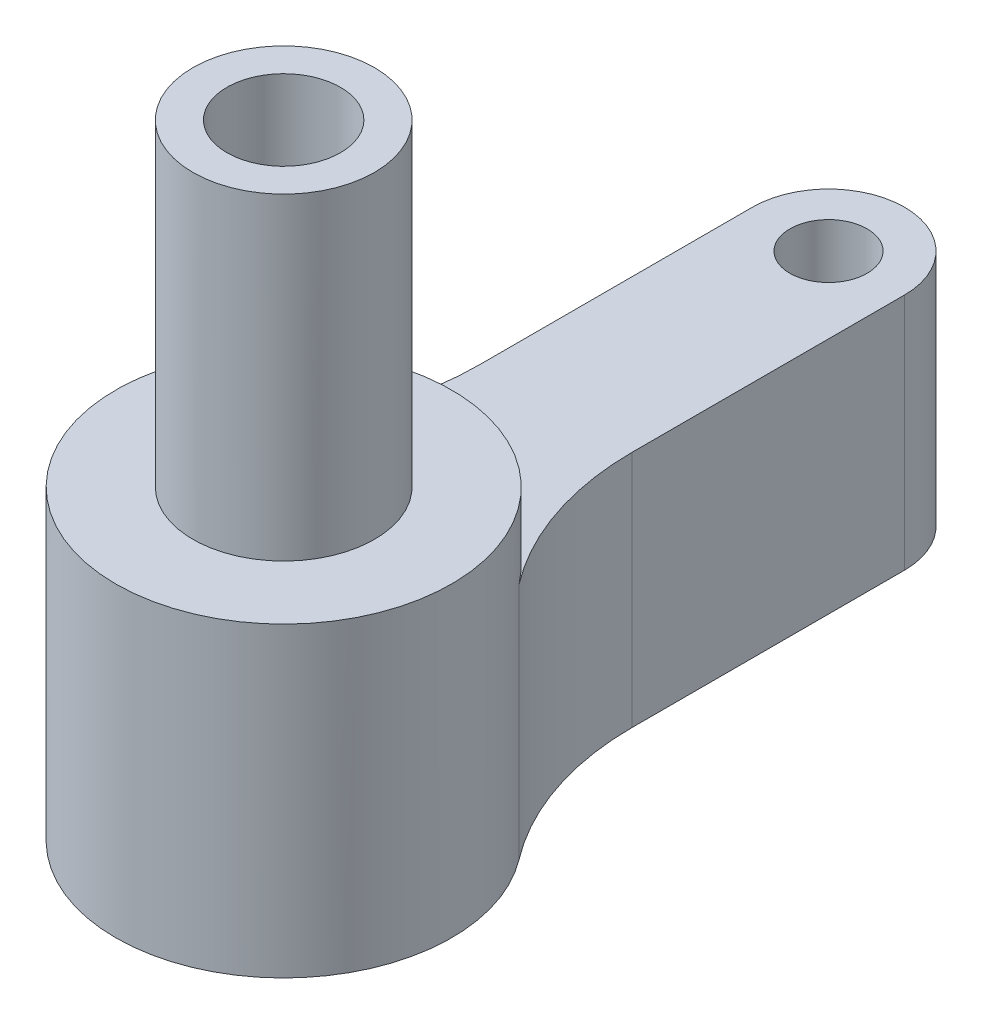
ISO-10303-21;
HEADER;
FILE_DESCRIPTION(('STEP AP214'),'2;1');
FILE_NAME('part.step','',(''),(''),'','','');
FILE_SCHEMA(('AUTOMOTIVE_DESIGN { 1 0 10303 214 1 1 1 1 }'));
ENDSEC;
DATA;
#1=APPLICATION_CONTEXT('core data for automotive mechanical design processes');
#2=APPLICATION_PROTOCOL_DEFINITION('international standard','automotive_design',2000,#1);
#3=PRODUCT_CONTEXT('',#1,'mechanical');
#4=PRODUCT('Part','Part','',(#3));
#5=PRODUCT_RELATED_PRODUCT_CATEGORY('part','',(#4));
#6=PRODUCT_DEFINITION_FORMATION('','',#4);
#7=PRODUCT_DEFINITION_CONTEXT('part definition',#1,'design');
#8=PRODUCT_DEFINITION('design','',#6,#7);
#9=PRODUCT_DEFINITION_SHAPE('','',#8);
#10=(LENGTH_UNIT() NAMED_UNIT(*) SI_UNIT(.MILLI.,.METRE.));
#11=(NAMED_UNIT(*) PLANE_ANGLE_UNIT() SI_UNIT($,.RADIAN.));
#12=(NAMED_UNIT(*) SI_UNIT($,.STERADIAN.) SOLID_ANGLE_UNIT());
#13=UNCERTAINTY_MEASURE_WITH_UNIT(LENGTH_MEASURE(1.E-05),#10,'distance_accuracy_value','');
#14=(GEOMETRIC_REPRESENTATION_CONTEXT(3) GLOBAL_UNCERTAINTY_ASSIGNED_CONTEXT((#13)) GLOBAL_UNIT_ASSIGNED_CONTEXT((#10,
#11,#12)) REPRESENTATION_CONTEXT('',''));
#15=CARTESIAN_POINT('',(0.,0.,0.));
#16=DIRECTION('',(0.,0.,1.));
#17=DIRECTION('',(1.,0.,0.));
#18=AXIS2_PLACEMENT_3D('',#15,#16,#17);
#19=CARTESIAN_POINT('',(0.,-6.75,-24.));
#20=DIRECTION('',(0.,1.,0.));
#21=DIRECTION('',(0.,0.,1.));
#22=AXIS2_PLACEMENT_3D('',#19,#20,#21);
#23=CYLINDRICAL_SURFACE('',#22,3.35);
#24=DIRECTION('',(0.,1.,0.));
#25=VECTOR('',#24,1.);
#26=CARTESIAN_POINT('',(-3.35,-6.75,-24.));
#27=LINE('',#26,#25);
#28=CARTESIAN_POINT('',(-3.35,-6.75,-24.));
#29=VERTEX_POINT('',#28);
#30=CARTESIAN_POINT('',(-3.35,3.75,-24.));
#31=VERTEX_POINT('',#30);
#32=EDGE_CURVE('E131',#29,#31,#27,.T.);
#33=ORIENTED_EDGE('',*,*,#32,.T.);
#34=CARTESIAN_POINT('',(0.,3.75,-24.));
#35=DIRECTION('',(0.,1.,0.));
#36=DIRECTION('',(0.,0.,1.));
#37=AXIS2_PLACEMENT_3D('',#34,#35,#36);
#38=CIRCLE('',#37,3.35);
#39=CARTESIAN_POINT('',(3.35000000000001,3.75,-24.));
#40=VERTEX_POINT('',#39);
#41=EDGE_CURVE('E113',#40,#31,#38,.T.);
#42=ORIENTED_EDGE('',*,*,#41,.F.);
#43=DIRECTION('',(0.,1.,0.));
#44=VECTOR('',#43,1.);
#45=CARTESIAN_POINT('',(3.35000000000001,-6.75,-24.));
#46=LINE('',#45,#44);
#47=CARTESIAN_POINT('',(3.35000000000001,-6.75,-24.));
#48=VERTEX_POINT('',#47);
#49=EDGE_CURVE('E56',#48,#40,#46,.T.);
#50=ORIENTED_EDGE('',*,*,#49,.F.);
#51=CARTESIAN_POINT('',(0.,-6.75,-24.));
#52=DIRECTION('',(0.,1.,0.));
#53=DIRECTION('',(0.,0.,-1.));
#54=AXIS2_PLACEMENT_3D('',#51,#52,#53);
#55=CIRCLE('',#54,3.35);
#56=EDGE_CURVE('E145',#48,#29,#55,.T.);
#57=ORIENTED_EDGE('',*,*,#56,.T.);
#58=EDGE_LOOP('',(#33,#42,#50,#57));
#59=FACE_BOUND('',#58,.T.);
#60=ADVANCED_FACE('F48',(#59),#23,.T.);
#61=CARTESIAN_POINT('',(3.35000000000001,-6.75,-24.));
#62=DIRECTION('',(1.,0.,0.));
#63=DIRECTION('',(0.,0.,-1.));
#64=AXIS2_PLACEMENT_3D('',#61,#62,#63);
#65=PLANE('',#64);
#66=ORIENTED_EDGE('',*,*,#49,.T.);
#67=DIRECTION('',(0.,0.,-1.));
#68=VECTOR('',#67,1.);
#69=CARTESIAN_POINT('',(3.35000000000001,3.75,-12.));
#70=LINE('',#69,#68);
#71=CARTESIAN_POINT('',(3.35000000000001,3.75,-12.));
#72=VERTEX_POINT('',#71);
#73=EDGE_CURVE('E106',#72,#40,#70,.T.);
#74=ORIENTED_EDGE('',*,*,#73,.F.);
#75=DIRECTION('',(0.,1.,0.));
#76=VECTOR('',#75,1.);
#77=CARTESIAN_POINT('',(3.35000000000001,-6.75,-12.));
#78=LINE('',#77,#76);
#79=CARTESIAN_POINT('',(3.35000000000001,-6.75,-12.));
#80=VERTEX_POINT('',#79);
#81=EDGE_CURVE('E70',#80,#72,#78,.T.);
#82=ORIENTED_EDGE('',*,*,#81,.F.);
#83=DIRECTION('',(0.,0.,-1.));
#84=VECTOR('',#83,1.);
#85=CARTESIAN_POINT('',(3.35000000000001,-6.75,-24.));
#86=LINE('',#85,#84);
#87=EDGE_CURVE('E133',#80,#48,#86,.T.);
#88=ORIENTED_EDGE('',*,*,#87,.T.);
#89=EDGE_LOOP('',(#66,#74,#82,#88));
#90=FACE_BOUND('',#89,.T.);
#91=ADVANCED_FACE('F112',(#90),#65,.T.);
#92=CARTESIAN_POINT('',(15.7527777777778,-6.75,-12.));
#93=DIRECTION('',(0.,1.,0.));
#94=DIRECTION('',(0.,0.,1.));
#95=AXIS2_PLACEMENT_3D('',#92,#93,#94);
#96=CYLINDRICAL_SURFACE('',#95,12.4027777777778);
#97=ORIENTED_EDGE('',*,*,#81,.T.);
#98=CARTESIAN_POINT('',(15.7527777777778,3.75,-12.));
#99=DIRECTION('',(0.,-1.,0.));
#100=DIRECTION('',(0.,0.,1.));
#101=AXIS2_PLACEMENT_3D('',#98,#99,#100);
#102=CIRCLE('',#101,12.4027777777778);
#103=CARTESIAN_POINT('',(5.88657595735728,3.75,-4.48421938560808));
#104=VERTEX_POINT('',#103);
#105=EDGE_CURVE('E103',#104,#72,#102,.T.);
#106=ORIENTED_EDGE('',*,*,#105,.F.);
#107=DIRECTION('',(0.,1.,0.));
#108=VECTOR('',#107,1.);
#109=CARTESIAN_POINT('',(5.88657595735728,-6.75,-4.48421938560808));
#110=LINE('',#109,#108);
#111=CARTESIAN_POINT('',(5.88657595735728,-6.75,-4.48421938560808));
#112=VERTEX_POINT('',#111);
#113=EDGE_CURVE('E119',#112,#104,#110,.T.);
#114=ORIENTED_EDGE('',*,*,#113,.F.);
#115=CARTESIAN_POINT('',(15.7527777777778,-6.75,-12.));
#116=DIRECTION('',(0.,-1.,0.));
#117=DIRECTION('',(0.,0.,-1.));
#118=AXIS2_PLACEMENT_3D('',#115,#116,#117);
#119=CIRCLE('',#118,12.4027777777778);
#120=EDGE_CURVE('E117',#112,#80,#119,.T.);
#121=ORIENTED_EDGE('',*,*,#120,.T.);
#122=EDGE_LOOP('',(#97,#106,#114,#121));
#123=FACE_BOUND('',#122,.T.);
#124=ADVANCED_FACE('F115',(#123),#96,.F.);
#125=CARTESIAN_POINT('',(-15.7527777777778,-6.75,-12.));
#126=DIRECTION('',(0.,1.,0.));
#127=DIRECTION('',(0.,0.,1.));
#128=AXIS2_PLACEMENT_3D('',#125,#126,#127);
#129=CYLINDRICAL_SURFACE('',#128,12.4027777777778);
#130=DIRECTION('',(0.,1.,0.));
#131=VECTOR('',#130,1.);
#132=CARTESIAN_POINT('',(-5.88657595735728,-6.75,-4.48421938560808));
#133=LINE('',#132,#131);
#134=CARTESIAN_POINT('',(-5.88657595735728,-6.75,-4.48421938560808));
#135=VERTEX_POINT('',#134);
#136=CARTESIAN_POINT('',(-5.88657595735728,3.75,-4.48421938560808));
#137=VERTEX_POINT('',#136);
#138=EDGE_CURVE('E122',#135,#137,#133,.T.);
#139=ORIENTED_EDGE('',*,*,#138,.T.);
#140=CARTESIAN_POINT('',(-15.7527777777778,3.75,-12.));
#141=DIRECTION('',(0.,-1.,0.));
#142=DIRECTION('',(0.,0.,1.));
#143=AXIS2_PLACEMENT_3D('',#140,#141,#142);
#144=CIRCLE('',#143,12.4027777777778);
#145=CARTESIAN_POINT('',(-3.35,3.75,-12.));
#146=VERTEX_POINT('',#145);
#147=EDGE_CURVE('E169',#146,#137,#144,.T.);
#148=ORIENTED_EDGE('',*,*,#147,.F.);
#149=DIRECTION('',(0.,1.,0.));
#150=VECTOR('',#149,1.);
#151=CARTESIAN_POINT('',(-3.35,-6.75,-12.));
#152=LINE('',#151,#150);
#153=CARTESIAN_POINT('',(-3.35,-6.75,-12.));
#154=VERTEX_POINT('',#153);
#155=EDGE_CURVE('E128',#154,#146,#152,.T.);
#156=ORIENTED_EDGE('',*,*,#155,.F.);
#157=CARTESIAN_POINT('',(-15.7527777777778,-6.75,-12.));
#158=DIRECTION('',(0.,-1.,0.));
#159=DIRECTION('',(0.,0.,1.));
#160=AXIS2_PLACEMENT_3D('',#157,#158,#159);
#161=CIRCLE('',#160,12.4027777777778);
#162=EDGE_CURVE('E139',#154,#135,#161,.T.);
#163=ORIENTED_EDGE('',*,*,#162,.T.);
#164=EDGE_LOOP('',(#139,#148,#156,#163));
#165=FACE_BOUND('',#164,.T.);
#166=ADVANCED_FACE('F180',(#165),#129,.F.);
#167=CARTESIAN_POINT('',(-3.35,-6.75,-24.));
#168=DIRECTION('',(-1.,0.,0.));
#169=DIRECTION('',(0.,0.,1.));
#170=AXIS2_PLACEMENT_3D('',#167,#168,#169);
#171=PLANE('',#170);
#172=ORIENTED_EDGE('',*,*,#155,.T.);
#173=DIRECTION('',(0.,0.,1.));
#174=VECTOR('',#173,1.);
#175=CARTESIAN_POINT('',(-3.35,3.75,-24.));
#176=LINE('',#175,#174);
#177=EDGE_CURVE('E171',#31,#146,#176,.T.);
#178=ORIENTED_EDGE('',*,*,#177,.F.);
#179=ORIENTED_EDGE('',*,*,#32,.F.);
#180=DIRECTION('',(0.,0.,1.));
#181=VECTOR('',#180,1.);
#182=CARTESIAN_POINT('',(-3.35,-6.75,-24.));
#183=LINE('',#182,#181);
#184=EDGE_CURVE('E142',#29,#154,#183,.T.);
#185=ORIENTED_EDGE('',*,*,#184,.T.);
#186=EDGE_LOOP('',(#172,#178,#179,#185));
#187=FACE_BOUND('',#186,.T.);
#188=ADVANCED_FACE('F176',(#187),#171,.T.);
#189=CARTESIAN_POINT('',(0.,-6.75,-24.));
#190=DIRECTION('',(0.,1.,0.));
#191=DIRECTION('',(0.,0.,1.));
#192=AXIS2_PLACEMENT_3D('',#189,#190,#191);
#193=CYLINDRICAL_SURFACE('',#192,1.7);
#194=CARTESIAN_POINT('',(0.,-6.75,-24.));
#195=DIRECTION('',(0.,1.,0.));
#196=DIRECTION('',(0.,0.,1.));
#197=AXIS2_PLACEMENT_3D('',#194,#195,#196);
#198=CIRCLE('',#197,1.7);
#199=CARTESIAN_POINT('',(0.,-6.75,-22.3));
#200=VERTEX_POINT('',#199);
#201=EDGE_CURVE('E147',#200,#200,#198,.T.);
#202=ORIENTED_EDGE('',*,*,#201,.F.);
#203=EDGE_LOOP('',(#202));
#204=FACE_BOUND('',#203,.T.);
#205=CARTESIAN_POINT('',(0.,3.75,-24.));
#206=DIRECTION('',(0.,1.,0.));
#207=DIRECTION('',(0.,0.,1.));
#208=AXIS2_PLACEMENT_3D('',#205,#206,#207);
#209=CIRCLE('',#208,1.7);
#210=CARTESIAN_POINT('',(0.,3.75,-22.3));
#211=VERTEX_POINT('',#210);
#212=EDGE_CURVE('E51',#211,#211,#209,.F.);
#213=ORIENTED_EDGE('',*,*,#212,.F.);
#214=EDGE_LOOP('',(#213));
#215=FACE_BOUND('',#214,.T.);
#216=ADVANCED_FACE('F187',(#204,#215),#193,.F.);
#217=CARTESIAN_POINT('',(0.,-6.75,0.));
#218=DIRECTION('',(0.,1.,0.));
#219=DIRECTION('',(0.,0.,1.));
#220=AXIS2_PLACEMENT_3D('',#217,#218,#219);
#221=CYLINDRICAL_SURFACE('',#220,7.4);
#222=CARTESIAN_POINT('',(0.,6.75,0.));
#223=DIRECTION('',(0.,1.,0.));
#224=DIRECTION('',(0.,0.,1.));
#225=AXIS2_PLACEMENT_3D('',#222,#223,#224);
#226=CIRCLE('',#225,7.4);
#227=CARTESIAN_POINT('',(0.,6.75,7.4));
#228=VERTEX_POINT('',#227);
#229=EDGE_CURVE('E150',#228,#228,#226,.T.);
#230=ORIENTED_EDGE('',*,*,#229,.F.);
#231=EDGE_LOOP('',(#230));
#232=FACE_BOUND('',#231,.T.);
#233=ORIENTED_EDGE('',*,*,#113,.T.);
#234=CARTESIAN_POINT('',(0.,3.75,0.));
#235=DIRECTION('',(0.,-1.,0.));
#236=DIRECTION('',(0.,0.,1.));
#237=AXIS2_PLACEMENT_3D('',#234,#235,#236);
#238=CIRCLE('',#237,7.4);
#239=EDGE_CURVE('E108',#137,#104,#238,.T.);
#240=ORIENTED_EDGE('',*,*,#239,.F.);
#241=ORIENTED_EDGE('',*,*,#138,.F.);
#242=CARTESIAN_POINT('',(0.,-6.75,0.));
#243=DIRECTION('',(0.,1.,0.));
#244=DIRECTION('',(0.,0.,1.));
#245=AXIS2_PLACEMENT_3D('',#242,#243,#244);
#246=CIRCLE('',#245,7.4);
#247=EDGE_CURVE('E134',#135,#112,#246,.T.);
#248=ORIENTED_EDGE('',*,*,#247,.T.);
#249=EDGE_LOOP('',(#233,#240,#241,#248));
#250=FACE_BOUND('',#249,.T.);
#251=ADVANCED_FACE('F185',(#232,#250),#221,.T.);
#252=CARTESIAN_POINT('',(0.,-6.75,-24.));
#253=DIRECTION('',(0.,-1.,0.));
#254=DIRECTION('',(0.,0.,-1.));
#255=AXIS2_PLACEMENT_3D('',#252,#253,#254);
#256=PLANE('',#255);
#257=ORIENTED_EDGE('',*,*,#201,.T.);
#258=EDGE_LOOP('',(#257));
#259=FACE_BOUND('',#258,.T.);
#260=ORIENTED_EDGE('',*,*,#56,.F.);
#261=ORIENTED_EDGE('',*,*,#87,.F.);
#262=ORIENTED_EDGE('',*,*,#120,.F.);
#263=ORIENTED_EDGE('',*,*,#247,.F.);
#264=ORIENTED_EDGE('',*,*,#162,.F.);
#265=ORIENTED_EDGE('',*,*,#184,.F.);
#266=EDGE_LOOP('',(#260,#261,#262,#263,#264,#265));
#267=FACE_BOUND('',#266,.T.);
#268=ADVANCED_FACE('F183',(#259,#267),#256,.T.);
#269=CARTESIAN_POINT('',(0.,6.75,-24.));
#270=DIRECTION('',(0.,-1.,0.));
#271=DIRECTION('',(0.,0.,-1.));
#272=AXIS2_PLACEMENT_3D('',#269,#270,#271);
#273=PLANE('',#272);
#274=CARTESIAN_POINT('',(0.,6.75,0.));
#275=DIRECTION('',(0.,-1.,0.));
#276=DIRECTION('',(0.,0.,-1.));
#277=AXIS2_PLACEMENT_3D('',#274,#275,#276);
#278=CIRCLE('',#277,4.);
#279=CARTESIAN_POINT('',(0.,6.75,-4.));
#280=VERTEX_POINT('',#279);
#281=EDGE_CURVE('E13',#280,#280,#278,.F.);
#282=ORIENTED_EDGE('',*,*,#281,.F.);
#283=EDGE_LOOP('',(#282));
#284=FACE_BOUND('',#283,.T.);
#285=ORIENTED_EDGE('',*,*,#229,.T.);
#286=EDGE_LOOP('',(#285));
#287=FACE_BOUND('',#286,.T.);
#288=ADVANCED_FACE('F195',(#284,#287),#273,.F.);
#289=CARTESIAN_POINT('',(0.,20.75,0.));
#290=DIRECTION('',(0.,-1.,0.));
#291=DIRECTION('',(0.,0.,-1.));
#292=AXIS2_PLACEMENT_3D('',#289,#290,#291);
#293=CYLINDRICAL_SURFACE('',#292,4.);
#294=CARTESIAN_POINT('',(0.,20.75,0.));
#295=DIRECTION('',(0.,1.,0.));
#296=DIRECTION('',(0.,0.,1.));
#297=AXIS2_PLACEMENT_3D('',#294,#295,#296);
#298=CIRCLE('',#297,4.);
#299=CARTESIAN_POINT('',(0.,20.75,4.));
#300=VERTEX_POINT('',#299);
#301=EDGE_CURVE('E153',#300,#300,#298,.T.);
#302=ORIENTED_EDGE('',*,*,#301,.F.);
#303=EDGE_LOOP('',(#302));
#304=FACE_BOUND('',#303,.T.);
#305=ORIENTED_EDGE('',*,*,#281,.T.);
#306=EDGE_LOOP('',(#305));
#307=FACE_BOUND('',#306,.T.);
#308=ADVANCED_FACE('F214',(#304,#307),#293,.T.);
#309=CARTESIAN_POINT('',(0.,20.75,0.));
#310=DIRECTION('',(0.,1.,0.));
#311=DIRECTION('',(0.,0.,1.));
#312=AXIS2_PLACEMENT_3D('',#309,#310,#311);
#313=PLANE('',#312);
#314=CARTESIAN_POINT('',(0.,20.75,0.));
#315=DIRECTION('',(0.,1.,0.));
#316=DIRECTION('',(0.,0.,1.));
#317=AXIS2_PLACEMENT_3D('',#314,#315,#316);
#318=CIRCLE('',#317,2.5);
#319=CARTESIAN_POINT('',(0.,20.75,2.5));
#320=VERTEX_POINT('',#319);
#321=EDGE_CURVE('E157',#320,#320,#318,.T.);
#322=ORIENTED_EDGE('',*,*,#321,.F.);
#323=EDGE_LOOP('',(#322));
#324=FACE_BOUND('',#323,.T.);
#325=ORIENTED_EDGE('',*,*,#301,.T.);
#326=EDGE_LOOP('',(#325));
#327=FACE_BOUND('',#326,.T.);
#328=ADVANCED_FACE('F218',(#324,#327),#313,.T.);
#329=CARTESIAN_POINT('',(0.,15.75,0.));
#330=DIRECTION('',(0.,1.,0.));
#331=DIRECTION('',(0.,0.,1.));
#332=AXIS2_PLACEMENT_3D('',#329,#330,#331);
#333=CYLINDRICAL_SURFACE('',#332,2.5);
#334=CARTESIAN_POINT('',(0.,15.75,0.));
#335=DIRECTION('',(0.,1.,0.));
#336=DIRECTION('',(0.,0.,1.));
#337=AXIS2_PLACEMENT_3D('',#334,#335,#336);
#338=CIRCLE('',#337,2.5);
#339=CARTESIAN_POINT('',(0.,15.75,2.5));
#340=VERTEX_POINT('',#339);
#341=EDGE_CURVE('E156',#340,#340,#338,.T.);
#342=ORIENTED_EDGE('',*,*,#341,.F.);
#343=EDGE_LOOP('',(#342));
#344=FACE_BOUND('',#343,.T.);
#345=ORIENTED_EDGE('',*,*,#321,.T.);
#346=EDGE_LOOP('',(#345));
#347=FACE_BOUND('',#346,.T.);
#348=ADVANCED_FACE('F222',(#344,#347),#333,.F.);
#349=CARTESIAN_POINT('',(0.,15.75,0.));
#350=DIRECTION('',(0.,1.,0.));
#351=DIRECTION('',(0.,0.,1.));
#352=AXIS2_PLACEMENT_3D('',#349,#350,#351);
#353=PLANE('',#352);
#354=CARTESIAN_POINT('',(0.,15.75,0.));
#355=DIRECTION('',(0.,1.,0.));
#356=DIRECTION('',(0.,0.,1.));
#357=AXIS2_PLACEMENT_3D('',#354,#355,#356);
#358=CIRCLE('',#357,1.7);
#359=CARTESIAN_POINT('',(0.,15.75,1.7));
#360=VERTEX_POINT('',#359);
#361=EDGE_CURVE('E165',#360,#360,#358,.T.);
#362=ORIENTED_EDGE('',*,*,#361,.F.);
#363=EDGE_LOOP('',(#362));
#364=FACE_BOUND('',#363,.T.);
#365=ORIENTED_EDGE('',*,*,#341,.T.);
#366=EDGE_LOOP('',(#365));
#367=FACE_BOUND('',#366,.T.);
#368=ADVANCED_FACE('F226',(#364,#367),#353,.T.);
#369=CARTESIAN_POINT('',(0.,-1.75,-24.));
#370=DIRECTION('',(0.,-1.,0.));
#371=DIRECTION('',(0.,0.,-1.));
#372=AXIS2_PLACEMENT_3D('',#369,#370,#371);
#373=PLANE('',#372);
#374=CARTESIAN_POINT('',(0.,-1.75,0.));
#375=DIRECTION('',(0.,-1.,0.));
#376=DIRECTION('',(0.,0.,-1.));
#377=AXIS2_PLACEMENT_3D('',#374,#375,#376);
#378=CIRCLE('',#377,1.7);
#379=CARTESIAN_POINT('',(0.,-1.75,1.7));
#380=VERTEX_POINT('',#379);
#381=EDGE_CURVE('E160',#380,#380,#378,.F.);
#382=ORIENTED_EDGE('',*,*,#381,.T.);
#383=EDGE_LOOP('',(#382));
#384=FACE_BOUND('',#383,.T.);
#385=ADVANCED_FACE('F230',(#384),#373,.F.);
#386=CARTESIAN_POINT('',(0.,-11.5583261120685,0.));
#387=DIRECTION('',(0.,1.,0.));
#388=DIRECTION('',(0.,0.,1.));
#389=AXIS2_PLACEMENT_3D('',#386,#387,#388);
#390=CYLINDRICAL_SURFACE('',#389,1.7);
#391=CARTESIAN_POINT('',(0.,15.75,1.7));
#392=CARTESIAN_POINT('',(0.,15.5677083333333,1.7));
#393=CARTESIAN_POINT('',(0.,15.3854166666667,1.7));
#394=CARTESIAN_POINT('',(0.,15.0208333333333,1.7));
#395=CARTESIAN_POINT('',(0.,14.8385416666667,1.7));
#396=CARTESIAN_POINT('',(0.,14.4739583333333,1.7));
#397=CARTESIAN_POINT('',(0.,14.2916666666667,1.7));
#398=CARTESIAN_POINT('',(0.,13.9270833333333,1.7));
#399=CARTESIAN_POINT('',(0.,13.7447916666667,1.7));
#400=CARTESIAN_POINT('',(0.,13.3802083333333,1.7));
#401=CARTESIAN_POINT('',(0.,13.1979166666667,1.7));
#402=CARTESIAN_POINT('',(0.,12.8333333333333,1.7));
#403=CARTESIAN_POINT('',(0.,12.6510416666667,1.7));
#404=CARTESIAN_POINT('',(0.,12.2864583333333,1.7));
#405=CARTESIAN_POINT('',(0.,12.1041666666667,1.7));
#406=CARTESIAN_POINT('',(0.,11.7395833333333,1.7));
#407=CARTESIAN_POINT('',(0.,11.5572916666667,1.7));
#408=CARTESIAN_POINT('',(0.,11.1927083333333,1.7));
#409=CARTESIAN_POINT('',(0.,11.0104166666667,1.7));
#410=CARTESIAN_POINT('',(0.,10.6458333333333,1.7));
#411=CARTESIAN_POINT('',(0.,10.4635416666667,1.7));
#412=CARTESIAN_POINT('',(0.,10.0989583333333,1.7));
#413=CARTESIAN_POINT('',(0.,9.91666666666666,1.7));
#414=CARTESIAN_POINT('',(0.,9.55208333333333,1.7));
#415=CARTESIAN_POINT('',(0.,9.36979166666666,1.7));
#416=CARTESIAN_POINT('',(0.,9.00520833333333,1.7));
#417=CARTESIAN_POINT('',(0.,8.82291666666666,1.7));
#418=CARTESIAN_POINT('',(0.,8.45833333333333,1.7));
#419=CARTESIAN_POINT('',(0.,8.27604166666666,1.7));
#420=CARTESIAN_POINT('',(0.,7.91145833333333,1.7));
#421=CARTESIAN_POINT('',(0.,7.72916666666666,1.7));
#422=CARTESIAN_POINT('',(0.,7.36458333333333,1.7));
#423=CARTESIAN_POINT('',(0.,7.18229166666667,1.7));
#424=CARTESIAN_POINT('',(0.,6.81770833333333,1.7));
#425=CARTESIAN_POINT('',(0.,6.63541666666666,1.7));
#426=CARTESIAN_POINT('',(0.,6.27083333333333,1.7));
#427=CARTESIAN_POINT('',(0.,6.08854166666666,1.7));
#428=CARTESIAN_POINT('',(0.,5.72395833333333,1.7));
#429=CARTESIAN_POINT('',(0.,5.54166666666666,1.7));
#430=CARTESIAN_POINT('',(0.,5.17708333333333,1.7));
#431=CARTESIAN_POINT('',(0.,4.99479166666666,1.7));
#432=CARTESIAN_POINT('',(0.,4.63020833333333,1.7));
#433=CARTESIAN_POINT('',(0.,4.44791666666666,1.7));
#434=CARTESIAN_POINT('',(0.,4.08333333333333,1.7));
#435=CARTESIAN_POINT('',(0.,3.90104166666666,1.7));
#436=CARTESIAN_POINT('',(0.,3.53645833333333,1.7));
#437=CARTESIAN_POINT('',(0.,3.35416666666666,1.7));
#438=CARTESIAN_POINT('',(0.,2.98958333333333,1.7));
#439=CARTESIAN_POINT('',(0.,2.80729166666666,1.7));
#440=CARTESIAN_POINT('',(0.,2.44270833333333,1.7));
#441=CARTESIAN_POINT('',(0.,2.26041666666666,1.7));
#442=CARTESIAN_POINT('',(0.,1.89583333333333,1.7));
#443=CARTESIAN_POINT('',(0.,1.71354166666666,1.7));
#444=CARTESIAN_POINT('',(0.,1.34895833333333,1.7));
#445=CARTESIAN_POINT('',(0.,1.16666666666666,1.7));
#446=CARTESIAN_POINT('',(0.,0.802083333333331,1.7));
#447=CARTESIAN_POINT('',(0.,0.619791666666664,1.7));
#448=CARTESIAN_POINT('',(0.,0.25520833333333,1.7));
#449=CARTESIAN_POINT('',(0.,0.0729166666666633,1.7));
#450=CARTESIAN_POINT('',(0.,-0.29166666666667,1.7));
#451=CARTESIAN_POINT('',(0.,-0.473958333333336,1.7));
#452=CARTESIAN_POINT('',(0.,-0.83854166666667,1.7));
#453=CARTESIAN_POINT('',(0.,-1.02083333333334,1.7));
#454=CARTESIAN_POINT('',(0.,-1.38541666666667,1.7));
#455=CARTESIAN_POINT('',(0.,-1.56770833333334,1.7));
#456=CARTESIAN_POINT('',(0.,-1.75,1.7));
#457=B_SPLINE_CURVE_WITH_KNOTS('',3,(#391,#392,#393,#394,#395,#396,#397,#398,#399,#400,#401,
#402,#403,#404,#405,#406,#407,#408,#409,#410,#411,#412,#413,#414,#415,#416,#417,#418,#419,#420,
#421,#422,#423,#424,#425,#426,#427,#428,#429,#430,#431,#432,#433,#434,#435,#436,#437,#438,#439,
#440,#441,#442,#443,#444,#445,#446,#447,#448,#449,#450,#451,#452,#453,#454,#455,#456),
.UNSPECIFIED.,.F.,.F.,(4,2,2,2,2,2,2,2,2,2,2,2,2,2,2,2,2,2,2,2,2,2,2,2,2,2,2,2,2,2,2,2,4),(0.,
0.546874999999999,1.09375,1.640625,2.1875,2.734375,3.28125,3.828125,4.375,4.921875,5.46875,
6.015625,6.5625,7.109375,7.65625,8.203125,8.75,9.296875,9.84375000000001,10.390625,10.9375,
11.484375,12.03125,12.578125,13.125,13.671875,14.21875,14.765625,15.3125,15.859375,16.40625,
16.953125,17.5),.UNSPECIFIED.);
#458=EDGE_CURVE('BSEAM234',#360,#380,#457,.T.);
#459=ORIENTED_EDGE('',*,*,#361,.T.);
#460=ORIENTED_EDGE('',*,*,#381,.F.);
#461=ORIENTED_EDGE('',*,*,#458,.T.);
#462=ORIENTED_EDGE('',*,*,#458,.F.);
#463=EDGE_LOOP('',(#459,#461,#460,#462));
#464=FACE_BOUND('',#463,.T.);
#465=ADVANCED_FACE('F234',(#464),#390,.F.);
#466=CARTESIAN_POINT('',(15.7527777777778,3.75,-12.));
#467=DIRECTION('',(0.,1.,0.));
#468=DIRECTION('',(0.,0.,1.));
#469=AXIS2_PLACEMENT_3D('',#466,#467,#468);
#470=PLANE('',#469);
#471=ORIENTED_EDGE('',*,*,#105,.T.);
#472=ORIENTED_EDGE('',*,*,#73,.T.);
#473=ORIENTED_EDGE('',*,*,#41,.T.);
#474=ORIENTED_EDGE('',*,*,#177,.T.);
#475=ORIENTED_EDGE('',*,*,#147,.T.);
#476=ORIENTED_EDGE('',*,*,#239,.T.);
#477=EDGE_LOOP('',(#471,#472,#473,#474,#475,#476));
#478=FACE_BOUND('',#477,.T.);
#479=ORIENTED_EDGE('',*,*,#212,.T.);
#480=EDGE_LOOP('',(#479));
#481=FACE_BOUND('',#480,.T.);
#482=ADVANCED_FACE('F104',(#478,#481),#470,.T.);
#483=CLOSED_SHELL('',(#60,#91,#124,#166,#188,#216,#251,#268,#288,#308,#328,#348,#368,#385,#465,#482));
#484=MANIFOLD_SOLID_BREP('B2',#483);
#485=ADVANCED_BREP_SHAPE_REPRESENTATION('',(#18,#484),#14);
#486=SHAPE_DEFINITION_REPRESENTATION(#9,#485);
ENDSEC;
END-ISO-10303-21;
